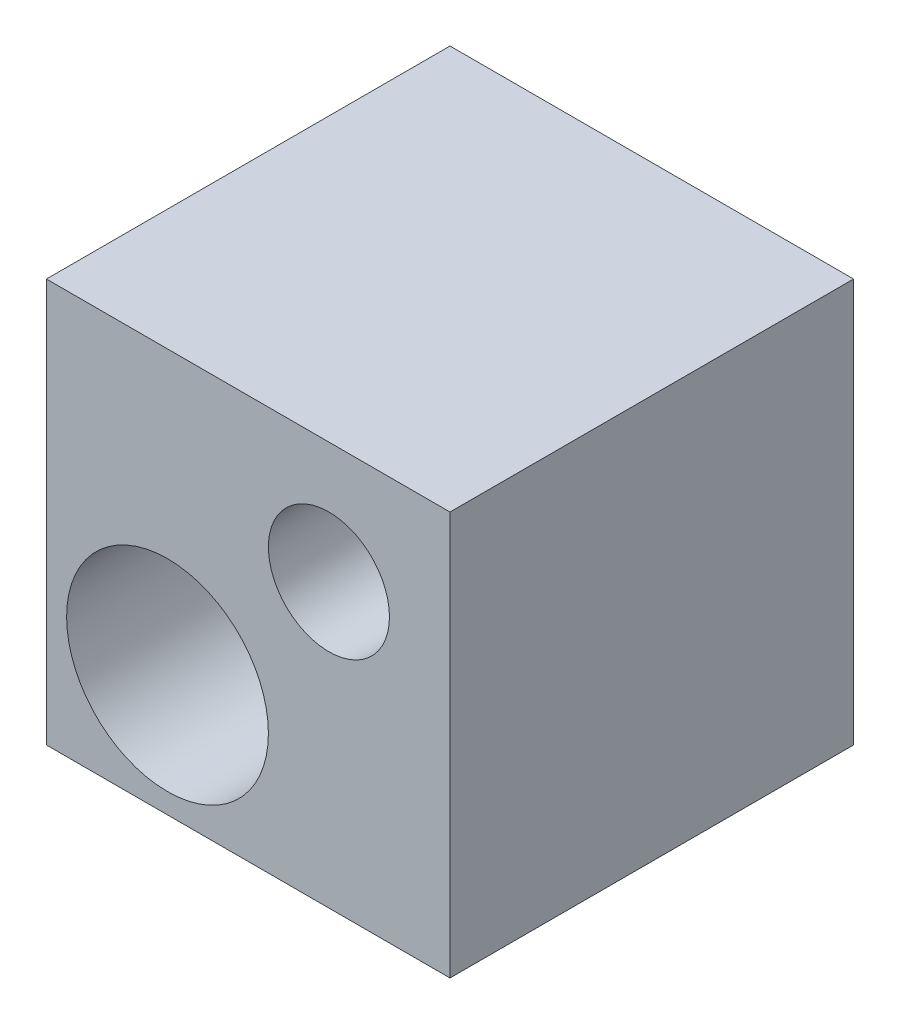
ISO-10303-21;
HEADER;
FILE_DESCRIPTION(('STEP AP214'),'2;1');
FILE_NAME('part.step','',(''),(''),'','','');
FILE_SCHEMA(('AUTOMOTIVE_DESIGN { 1 0 10303 214 1 1 1 1 }'));
ENDSEC;
DATA;
#1=APPLICATION_CONTEXT('core data for automotive mechanical design processes');
#2=APPLICATION_PROTOCOL_DEFINITION('international standard','automotive_design',2000,#1);
#3=PRODUCT_CONTEXT('',#1,'mechanical');
#4=PRODUCT('Part','Part','',(#3));
#5=PRODUCT_RELATED_PRODUCT_CATEGORY('part','',(#4));
#6=PRODUCT_DEFINITION_FORMATION('','',#4);
#7=PRODUCT_DEFINITION_CONTEXT('part definition',#1,'design');
#8=PRODUCT_DEFINITION('design','',#6,#7);
#9=PRODUCT_DEFINITION_SHAPE('','',#8);
#10=(LENGTH_UNIT() NAMED_UNIT(*) SI_UNIT(.MILLI.,.METRE.));
#11=(NAMED_UNIT(*) PLANE_ANGLE_UNIT() SI_UNIT($,.RADIAN.));
#12=(NAMED_UNIT(*) SI_UNIT($,.STERADIAN.) SOLID_ANGLE_UNIT());
#13=UNCERTAINTY_MEASURE_WITH_UNIT(LENGTH_MEASURE(1.E-05),#10,'distance_accuracy_value','');
#14=(GEOMETRIC_REPRESENTATION_CONTEXT(3) GLOBAL_UNCERTAINTY_ASSIGNED_CONTEXT((#13)) GLOBAL_UNIT_ASSIGNED_CONTEXT((#10,
#11,#12)) REPRESENTATION_CONTEXT('',''));
#15=CARTESIAN_POINT('',(0.,0.,0.));
#16=DIRECTION('',(0.,0.,1.));
#17=DIRECTION('',(1.,0.,0.));
#18=AXIS2_PLACEMENT_3D('',#15,#16,#17);
#19=CARTESIAN_POINT('',(0.,0.,10.));
#20=DIRECTION('',(1.,0.,0.));
#21=DIRECTION('',(0.,0.,-1.));
#22=AXIS2_PLACEMENT_3D('',#19,#20,#21);
#23=PLANE('',#22);
#24=DIRECTION('',(0.,-1.,0.));
#25=VECTOR('',#24,1.);
#26=CARTESIAN_POINT('',(0.,0.,0.));
#27=LINE('',#26,#25);
#28=CARTESIAN_POINT('',(0.,10.,0.));
#29=VERTEX_POINT('',#28);
#30=CARTESIAN_POINT('',(0.,0.,0.));
#31=VERTEX_POINT('',#30);
#32=EDGE_CURVE('E98',#29,#31,#27,.T.);
#33=ORIENTED_EDGE('',*,*,#32,.T.);
#34=DIRECTION('',(0.,0.,-1.));
#35=VECTOR('',#34,1.);
#36=CARTESIAN_POINT('',(0.,0.,10.));
#37=LINE('',#36,#35);
#38=CARTESIAN_POINT('',(0.,0.,10.));
#39=VERTEX_POINT('',#38);
#40=EDGE_CURVE('E11',#39,#31,#37,.T.);
#41=ORIENTED_EDGE('',*,*,#40,.F.);
#42=DIRECTION('',(0.,-1.,0.));
#43=VECTOR('',#42,1.);
#44=CARTESIAN_POINT('',(0.,0.,10.));
#45=LINE('',#44,#43);
#46=CARTESIAN_POINT('',(0.,10.,10.));
#47=VERTEX_POINT('',#46);
#48=EDGE_CURVE('E86',#47,#39,#45,.T.);
#49=ORIENTED_EDGE('',*,*,#48,.F.);
#50=DIRECTION('',(0.,0.,-1.));
#51=VECTOR('',#50,1.);
#52=CARTESIAN_POINT('',(0.,10.,10.));
#53=LINE('',#52,#51);
#54=EDGE_CURVE('E94',#47,#29,#53,.T.);
#55=ORIENTED_EDGE('',*,*,#54,.T.);
#56=EDGE_LOOP('',(#33,#41,#49,#55));
#57=FACE_BOUND('',#56,.T.);
#58=ADVANCED_FACE('F35',(#57),#23,.F.);
#59=CARTESIAN_POINT('',(0.,0.,10.));
#60=DIRECTION('',(0.,1.,0.));
#61=DIRECTION('',(0.,0.,1.));
#62=AXIS2_PLACEMENT_3D('',#59,#60,#61);
#63=PLANE('',#62);
#64=DIRECTION('',(1.,0.,0.));
#65=VECTOR('',#64,1.);
#66=CARTESIAN_POINT('',(0.,0.,0.));
#67=LINE('',#66,#65);
#68=CARTESIAN_POINT('',(10.,0.,0.));
#69=VERTEX_POINT('',#68);
#70=EDGE_CURVE('E90',#31,#69,#67,.T.);
#71=ORIENTED_EDGE('',*,*,#70,.T.);
#72=DIRECTION('',(0.,0.,-1.));
#73=VECTOR('',#72,1.);
#74=CARTESIAN_POINT('',(10.,0.,10.));
#75=LINE('',#74,#73);
#76=CARTESIAN_POINT('',(10.,0.,10.));
#77=VERTEX_POINT('',#76);
#78=EDGE_CURVE('E43',#77,#69,#75,.T.);
#79=ORIENTED_EDGE('',*,*,#78,.F.);
#80=DIRECTION('',(1.,0.,0.));
#81=VECTOR('',#80,1.);
#82=CARTESIAN_POINT('',(0.,0.,10.));
#83=LINE('',#82,#81);
#84=EDGE_CURVE('E81',#39,#77,#83,.T.);
#85=ORIENTED_EDGE('',*,*,#84,.F.);
#86=ORIENTED_EDGE('',*,*,#40,.T.);
#87=EDGE_LOOP('',(#71,#79,#85,#86));
#88=FACE_BOUND('',#87,.T.);
#89=ADVANCED_FACE('F89',(#88),#63,.F.);
#90=CARTESIAN_POINT('',(10.,0.,10.));
#91=DIRECTION('',(-1.,0.,0.));
#92=DIRECTION('',(0.,0.,1.));
#93=AXIS2_PLACEMENT_3D('',#90,#91,#92);
#94=PLANE('',#93);
#95=DIRECTION('',(0.,1.,0.));
#96=VECTOR('',#95,1.);
#97=CARTESIAN_POINT('',(10.,0.,0.));
#98=LINE('',#97,#96);
#99=CARTESIAN_POINT('',(10.,10.,0.));
#100=VERTEX_POINT('',#99);
#101=EDGE_CURVE('E68',#69,#100,#98,.T.);
#102=ORIENTED_EDGE('',*,*,#101,.T.);
#103=DIRECTION('',(0.,0.,-1.));
#104=VECTOR('',#103,1.);
#105=CARTESIAN_POINT('',(10.,10.,10.));
#106=LINE('',#105,#104);
#107=CARTESIAN_POINT('',(10.,10.,10.));
#108=VERTEX_POINT('',#107);
#109=EDGE_CURVE('E91',#108,#100,#106,.T.);
#110=ORIENTED_EDGE('',*,*,#109,.F.);
#111=DIRECTION('',(0.,1.,0.));
#112=VECTOR('',#111,1.);
#113=CARTESIAN_POINT('',(10.,0.,10.));
#114=LINE('',#113,#112);
#115=EDGE_CURVE('E84',#77,#108,#114,.T.);
#116=ORIENTED_EDGE('',*,*,#115,.F.);
#117=ORIENTED_EDGE('',*,*,#78,.T.);
#118=EDGE_LOOP('',(#102,#110,#116,#117));
#119=FACE_BOUND('',#118,.T.);
#120=ADVANCED_FACE('F92',(#119),#94,.F.);
#121=CARTESIAN_POINT('',(0.,10.,10.));
#122=DIRECTION('',(0.,-1.,0.));
#123=DIRECTION('',(0.,0.,-1.));
#124=AXIS2_PLACEMENT_3D('',#121,#122,#123);
#125=PLANE('',#124);
#126=DIRECTION('',(-1.,0.,0.));
#127=VECTOR('',#126,1.);
#128=CARTESIAN_POINT('',(0.,10.,0.));
#129=LINE('',#128,#127);
#130=EDGE_CURVE('E74',#100,#29,#129,.T.);
#131=ORIENTED_EDGE('',*,*,#130,.T.);
#132=ORIENTED_EDGE('',*,*,#54,.F.);
#133=DIRECTION('',(-1.,0.,0.));
#134=VECTOR('',#133,1.);
#135=CARTESIAN_POINT('',(0.,10.,10.));
#136=LINE('',#135,#134);
#137=EDGE_CURVE('E51',#108,#47,#136,.T.);
#138=ORIENTED_EDGE('',*,*,#137,.F.);
#139=ORIENTED_EDGE('',*,*,#109,.T.);
#140=EDGE_LOOP('',(#131,#132,#138,#139));
#141=FACE_BOUND('',#140,.T.);
#142=ADVANCED_FACE('F106',(#141),#125,.F.);
#143=CARTESIAN_POINT('',(0.,0.,10.));
#144=DIRECTION('',(0.,0.,-1.));
#145=DIRECTION('',(-1.,0.,0.));
#146=AXIS2_PLACEMENT_3D('',#143,#144,#145);
#147=PLANE('',#146);
#148=CARTESIAN_POINT('',(7.,7.,10.));
#149=DIRECTION('',(0.,0.,1.));
#150=DIRECTION('',(1.,0.,0.));
#151=AXIS2_PLACEMENT_3D('',#148,#149,#150);
#152=CIRCLE('',#151,1.5);
#153=CARTESIAN_POINT('',(8.5,7.,10.));
#154=VERTEX_POINT('',#153);
#155=EDGE_CURVE('E118',#154,#154,#152,.T.);
#156=ORIENTED_EDGE('',*,*,#155,.F.);
#157=EDGE_LOOP('',(#156));
#158=FACE_BOUND('',#157,.T.);
#159=CARTESIAN_POINT('',(3.,3.,10.));
#160=DIRECTION('',(0.,0.,1.));
#161=DIRECTION('',(1.,0.,0.));
#162=AXIS2_PLACEMENT_3D('',#159,#160,#161);
#163=CIRCLE('',#162,2.5);
#164=CARTESIAN_POINT('',(5.5,3.,10.));
#165=VERTEX_POINT('',#164);
#166=EDGE_CURVE('E112',#165,#165,#163,.T.);
#167=ORIENTED_EDGE('',*,*,#166,.F.);
#168=EDGE_LOOP('',(#167));
#169=FACE_BOUND('',#168,.T.);
#170=ORIENTED_EDGE('',*,*,#48,.T.);
#171=ORIENTED_EDGE('',*,*,#84,.T.);
#172=ORIENTED_EDGE('',*,*,#115,.T.);
#173=ORIENTED_EDGE('',*,*,#137,.T.);
#174=EDGE_LOOP('',(#170,#171,#172,#173));
#175=FACE_BOUND('',#174,.T.);
#176=ADVANCED_FACE('F82',(#158,#169,#175),#147,.F.);
#177=CARTESIAN_POINT('',(0.,0.,0.));
#178=DIRECTION('',(0.,0.,-1.));
#179=DIRECTION('',(-1.,0.,0.));
#180=AXIS2_PLACEMENT_3D('',#177,#178,#179);
#181=PLANE('',#180);
#182=CARTESIAN_POINT('',(7.,7.,0.));
#183=DIRECTION('',(0.,0.,1.));
#184=DIRECTION('',(1.,0.,0.));
#185=AXIS2_PLACEMENT_3D('',#182,#183,#184);
#186=CIRCLE('',#185,1.5);
#187=CARTESIAN_POINT('',(8.5,7.,0.));
#188=VERTEX_POINT('',#187);
#189=EDGE_CURVE('E115',#188,#188,#186,.T.);
#190=ORIENTED_EDGE('',*,*,#189,.T.);
#191=EDGE_LOOP('',(#190));
#192=FACE_BOUND('',#191,.T.);
#193=CARTESIAN_POINT('',(3.,3.,0.));
#194=DIRECTION('',(0.,0.,1.));
#195=DIRECTION('',(1.,0.,0.));
#196=AXIS2_PLACEMENT_3D('',#193,#194,#195);
#197=CIRCLE('',#196,2.5);
#198=CARTESIAN_POINT('',(5.5,3.,0.));
#199=VERTEX_POINT('',#198);
#200=EDGE_CURVE('E101',#199,#199,#197,.T.);
#201=ORIENTED_EDGE('',*,*,#200,.T.);
#202=EDGE_LOOP('',(#201));
#203=FACE_BOUND('',#202,.T.);
#204=ORIENTED_EDGE('',*,*,#32,.F.);
#205=ORIENTED_EDGE('',*,*,#130,.F.);
#206=ORIENTED_EDGE('',*,*,#101,.F.);
#207=ORIENTED_EDGE('',*,*,#70,.F.);
#208=EDGE_LOOP('',(#204,#205,#206,#207));
#209=FACE_BOUND('',#208,.T.);
#210=ADVANCED_FACE('F109',(#192,#203,#209),#181,.T.);
#211=CARTESIAN_POINT('',(3.,3.,0.));
#212=DIRECTION('',(0.,0.,1.));
#213=DIRECTION('',(1.,0.,0.));
#214=AXIS2_PLACEMENT_3D('',#211,#212,#213);
#215=CYLINDRICAL_SURFACE('',#214,2.5);
#216=ORIENTED_EDGE('',*,*,#200,.F.);
#217=EDGE_LOOP('',(#216));
#218=FACE_BOUND('',#217,.T.);
#219=ORIENTED_EDGE('',*,*,#166,.T.);
#220=EDGE_LOOP('',(#219));
#221=FACE_BOUND('',#220,.T.);
#222=ADVANCED_FACE('F129',(#218,#221),#215,.F.);
#223=CARTESIAN_POINT('',(7.,7.,0.));
#224=DIRECTION('',(0.,0.,1.));
#225=DIRECTION('',(1.,0.,0.));
#226=AXIS2_PLACEMENT_3D('',#223,#224,#225);
#227=CYLINDRICAL_SURFACE('',#226,1.5);
#228=ORIENTED_EDGE('',*,*,#189,.F.);
#229=EDGE_LOOP('',(#228));
#230=FACE_BOUND('',#229,.T.);
#231=ORIENTED_EDGE('',*,*,#155,.T.);
#232=EDGE_LOOP('',(#231));
#233=FACE_BOUND('',#232,.T.);
#234=ADVANCED_FACE('F126',(#230,#233),#227,.F.);
#235=CLOSED_SHELL('',(#58,#89,#120,#142,#176,#210,#222,#234));
#236=MANIFOLD_SOLID_BREP('B2',#235);
#237=ADVANCED_BREP_SHAPE_REPRESENTATION('',(#18,#236),#14);
#238=SHAPE_DEFINITION_REPRESENTATION(#9,#237);
ENDSEC;
END-ISO-10303-21;
